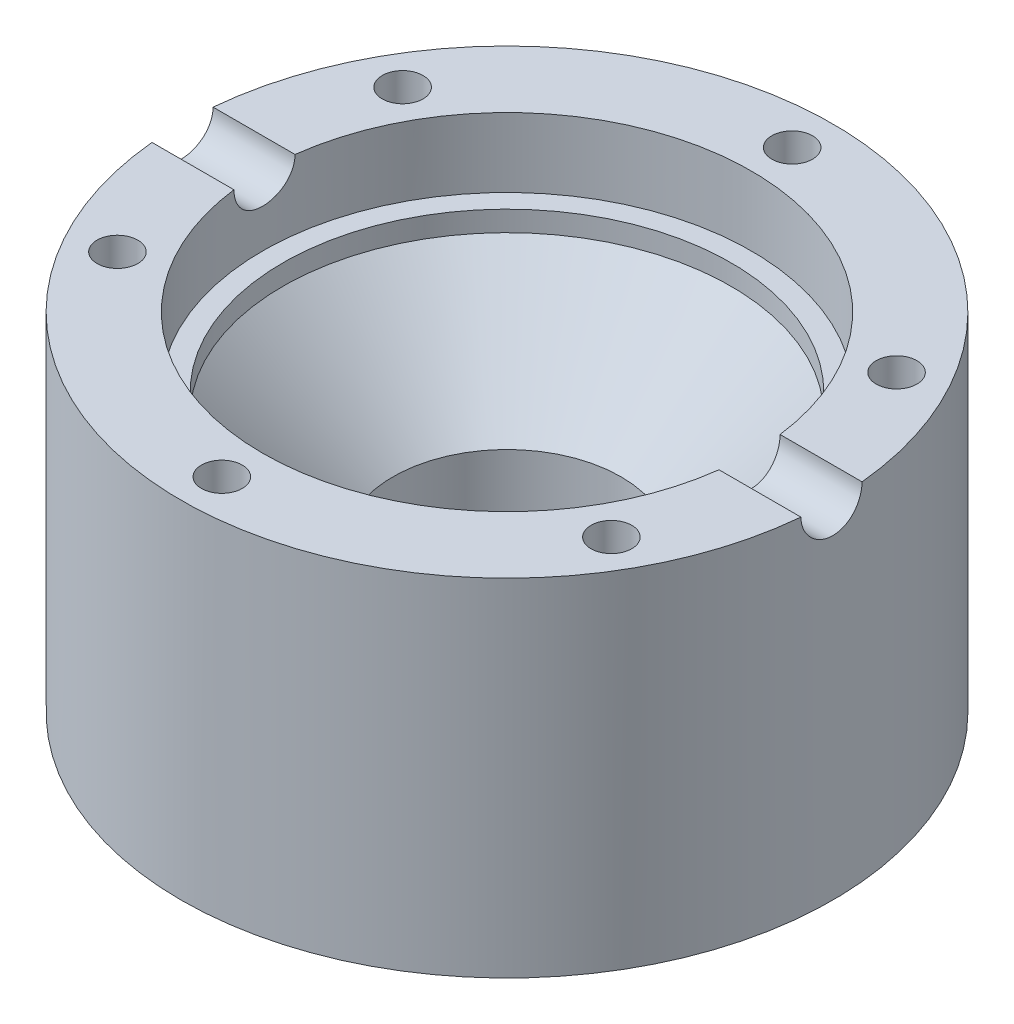
ISO-10303-21;
HEADER;
FILE_DESCRIPTION(('STEP AP214'),'2;1');
FILE_NAME('part.step','',(''),(''),'','','');
FILE_SCHEMA(('AUTOMOTIVE_DESIGN { 1 0 10303 214 1 1 1 1 }'));
ENDSEC;
DATA;
#1=APPLICATION_CONTEXT('core data for automotive mechanical design processes');
#2=APPLICATION_PROTOCOL_DEFINITION('international standard','automotive_design',2000,#1);
#3=PRODUCT_CONTEXT('',#1,'mechanical');
#4=PRODUCT('Part','Part','',(#3));
#5=PRODUCT_RELATED_PRODUCT_CATEGORY('part','',(#4));
#6=PRODUCT_DEFINITION_FORMATION('','',#4);
#7=PRODUCT_DEFINITION_CONTEXT('part definition',#1,'design');
#8=PRODUCT_DEFINITION('design','',#6,#7);
#9=PRODUCT_DEFINITION_SHAPE('','',#8);
#10=(LENGTH_UNIT() NAMED_UNIT(*) SI_UNIT(.MILLI.,.METRE.));
#11=(NAMED_UNIT(*) PLANE_ANGLE_UNIT() SI_UNIT($,.RADIAN.));
#12=(NAMED_UNIT(*) SI_UNIT($,.STERADIAN.) SOLID_ANGLE_UNIT());
#13=UNCERTAINTY_MEASURE_WITH_UNIT(LENGTH_MEASURE(1.E-05),#10,'distance_accuracy_value','');
#14=(GEOMETRIC_REPRESENTATION_CONTEXT(3) GLOBAL_UNCERTAINTY_ASSIGNED_CONTEXT((#13)) GLOBAL_UNIT_ASSIGNED_CONTEXT((#10,
#11,#12)) REPRESENTATION_CONTEXT('',''));
#15=CARTESIAN_POINT('',(0.,0.,0.));
#16=DIRECTION('',(0.,0.,1.));
#17=DIRECTION('',(1.,0.,0.));
#18=AXIS2_PLACEMENT_3D('',#15,#16,#17);
#19=CARTESIAN_POINT('',(0.,16.002,0.));
#20=DIRECTION('',(0.,1.,0.));
#21=DIRECTION('',(0.,0.,1.));
#22=AXIS2_PLACEMENT_3D('',#19,#20,#21);
#23=CONICAL_SURFACE('',#22,13.97,0.785398163397447);
#24=CARTESIAN_POINT('',(0.,16.002,0.));
#25=DIRECTION('',(0.,1.,0.));
#26=DIRECTION('',(0.,0.,1.));
#27=AXIS2_PLACEMENT_3D('',#24,#25,#26);
#28=CIRCLE('',#27,13.97);
#29=CARTESIAN_POINT('',(0.,16.002,13.97));
#30=VERTEX_POINT('',#29);
#31=EDGE_CURVE('E147',#30,#30,#28,.T.);
#32=ORIENTED_EDGE('',*,*,#31,.T.);
#33=EDGE_LOOP('',(#32));
#34=FACE_BOUND('',#33,.T.);
#35=CARTESIAN_POINT('',(0.,9.14399999999996,0.));
#36=DIRECTION('',(0.,1.,0.));
#37=DIRECTION('',(0.,0.,1.));
#38=AXIS2_PLACEMENT_3D('',#35,#36,#37);
#39=CIRCLE('',#38,7.112);
#40=CARTESIAN_POINT('',(0.,9.14399999999996,7.112));
#41=VERTEX_POINT('',#40);
#42=EDGE_CURVE('E216',#41,#41,#39,.F.);
#43=ORIENTED_EDGE('',*,*,#42,.T.);
#44=EDGE_LOOP('',(#43));
#45=FACE_BOUND('',#44,.T.);
#46=ADVANCED_FACE('F39',(#34,#45),#23,.F.);
#47=CARTESIAN_POINT('',(0.,21.59,0.));
#48=DIRECTION('',(0.,1.,0.));
#49=DIRECTION('',(0.,0.,1.));
#50=AXIS2_PLACEMENT_3D('',#47,#48,#49);
#51=PLANE('',#50);
#52=DIRECTION('',(1.,0.,0.));
#53=VECTOR('',#52,1.);
#54=CARTESIAN_POINT('',(-20.32,21.59,1.905));
#55=LINE('',#54,#53);
#56=CARTESIAN_POINT('',(-20.230506049034,21.59,1.905));
#57=VERTEX_POINT('',#56);
#58=CARTESIAN_POINT('',(-15.1204687427341,21.59,1.905));
#59=VERTEX_POINT('',#58);
#60=EDGE_CURVE('E61',#57,#59,#55,.T.);
#61=ORIENTED_EDGE('',*,*,#60,.F.);
#62=CARTESIAN_POINT('',(0.,21.59,0.));
#63=DIRECTION('',(0.,1.,0.));
#64=DIRECTION('',(0.,0.,1.));
#65=AXIS2_PLACEMENT_3D('',#62,#63,#64);
#66=CIRCLE('',#65,20.32);
#67=CARTESIAN_POINT('',(20.230506049034,21.59,1.905));
#68=VERTEX_POINT('',#67);
#69=EDGE_CURVE('E112',#57,#68,#66,.T.);
#70=ORIENTED_EDGE('',*,*,#69,.T.);
#71=CARTESIAN_POINT('',(15.1204687427341,21.59,1.905));
#72=VERTEX_POINT('',#71);
#73=EDGE_CURVE('E148',#72,#68,#55,.T.);
#74=ORIENTED_EDGE('',*,*,#73,.F.);
#75=CARTESIAN_POINT('',(0.,21.59,0.));
#76=DIRECTION('',(0.,1.,0.));
#77=DIRECTION('',(0.,0.,1.));
#78=AXIS2_PLACEMENT_3D('',#75,#76,#77);
#79=CIRCLE('',#78,15.24);
#80=EDGE_CURVE('E103',#59,#72,#79,.T.);
#81=ORIENTED_EDGE('',*,*,#80,.F.);
#82=EDGE_LOOP('',(#61,#70,#74,#81));
#83=FACE_BOUND('',#82,.T.);
#84=CARTESIAN_POINT('',(15.3979316792873,21.59,8.89000000000007));
#85=DIRECTION('',(0.,1.,0.));
#86=DIRECTION('',(-0.866025403784436,0.,-0.500000000000004));
#87=AXIS2_PLACEMENT_3D('',#84,#85,#86);
#88=CIRCLE('',#87,1.27);
#89=CARTESIAN_POINT('',(14.298079416481,21.59,8.25500000000007));
#90=VERTEX_POINT('',#89);
#91=EDGE_CURVE('E155',#90,#90,#88,.T.);
#92=ORIENTED_EDGE('',*,*,#91,.F.);
#93=EDGE_LOOP('',(#92));
#94=FACE_BOUND('',#93,.T.);
#95=CARTESIAN_POINT('',(0.,21.59,17.78));
#96=DIRECTION('',(0.,1.,0.));
#97=DIRECTION('',(0.,0.,-1.));
#98=AXIS2_PLACEMENT_3D('',#95,#96,#97);
#99=CIRCLE('',#98,1.27);
#100=CARTESIAN_POINT('',(0.,21.59,16.51));
#101=VERTEX_POINT('',#100);
#102=EDGE_CURVE('E163',#101,#101,#99,.T.);
#103=ORIENTED_EDGE('',*,*,#102,.F.);
#104=EDGE_LOOP('',(#103));
#105=FACE_BOUND('',#104,.T.);
#106=CARTESIAN_POINT('',(-15.3979316792874,21.59,8.88999999999985));
#107=DIRECTION('',(0.,1.,0.));
#108=DIRECTION('',(0.866025403784443,0.,-0.499999999999992));
#109=AXIS2_PLACEMENT_3D('',#106,#107,#108);
#110=CIRCLE('',#109,1.27);
#111=CARTESIAN_POINT('',(-14.2980794164812,21.59,8.25499999999986));
#112=VERTEX_POINT('',#111);
#113=EDGE_CURVE('E169',#112,#112,#110,.T.);
#114=ORIENTED_EDGE('',*,*,#113,.F.);
#115=EDGE_LOOP('',(#114));
#116=FACE_BOUND('',#115,.T.);
#117=ADVANCED_FACE('F200',(#83,#94,#105,#116),#51,.T.);
#118=CARTESIAN_POINT('',(0.,21.59,0.));
#119=DIRECTION('',(0.,-1.,0.));
#120=DIRECTION('',(0.,0.,-1.));
#121=AXIS2_PLACEMENT_3D('',#118,#119,#120);
#122=CYLINDRICAL_SURFACE('',#121,20.32);
#123=CARTESIAN_POINT('',(20.230506049034,21.59,-1.905));
#124=VERTEX_POINT('',#123);
#125=CARTESIAN_POINT('',(-20.230506049034,21.59,-1.905));
#126=VERTEX_POINT('',#125);
#127=EDGE_CURVE('E92',#124,#126,#66,.T.);
#128=ORIENTED_EDGE('',*,*,#127,.F.);
#129=CARTESIAN_POINT('',(20.230506049034,21.59,-1.905));
#130=CARTESIAN_POINT('',(20.2305048419639,21.536529886188,-1.9049997844618));
#131=CARTESIAN_POINT('',(20.2307183050446,21.4830855041032,-1.9027473617315));
#132=CARTESIAN_POINT('',(20.231561824142,21.3765814709534,-1.89376245028911));
#133=CARTESIAN_POINT('',(20.232191853417,21.3235217954131,-1.88703024915808));
#134=CARTESIAN_POINT('',(20.2346847598082,21.165596507574,-1.86018187930186));
#135=CARTESIAN_POINT('',(20.2371505441765,21.0617924238009,-1.83341374337296));
#136=CARTESIAN_POINT('',(20.2434143344982,20.8601801826428,-1.76289924237057));
#137=CARTESIAN_POINT('',(20.2472128561946,20.7623743637062,-1.71914630381519));
#138=CARTESIAN_POINT('',(20.2557124201876,20.5754921060027,-1.61591652294307));
#139=CARTESIAN_POINT('',(20.2604133454438,20.4864145374543,-1.55644171935339));
#140=CARTESIAN_POINT('',(20.2702044665111,20.3192475841751,-1.42325956423772));
#141=CARTESIAN_POINT('',(20.275295701896,20.2411892368867,-1.34951334578633));
#142=CARTESIAN_POINT('',(20.2852849434553,20.0985286835315,-1.18995465134418));
#143=CARTESIAN_POINT('',(20.2901829201158,20.0339285263536,-1.10414034142077));
#144=CARTESIAN_POINT('',(20.2992435007207,19.9199224956263,-0.922695322511813));
#145=CARTESIAN_POINT('',(20.3034047538332,19.8705444124154,-0.82704707951139));
#146=CARTESIAN_POINT('',(20.3105112772975,19.7885643113934,-0.628777299116423));
#147=CARTESIAN_POINT('',(20.3134566474185,19.7559609170826,-0.526156334673046));
#148=CARTESIAN_POINT('',(20.3177924388191,19.708544192658,-0.317169118568316));
#149=CARTESIAN_POINT('',(20.3191874090494,19.6936788088358,-0.21081477315429));
#150=CARTESIAN_POINT('',(20.320280691444,19.6819989793944,0.00289048637267596));
#151=CARTESIAN_POINT('',(20.3199790011529,19.6851845598983,0.110241401927612));
#152=CARTESIAN_POINT('',(20.3177166277443,19.7094744976171,0.322533435230876));
#153=CARTESIAN_POINT('',(20.3157611751202,19.7305223610124,0.427481080398319));
#154=CARTESIAN_POINT('',(20.310417139208,19.7898513703165,0.632347006443153));
#155=CARTESIAN_POINT('',(20.3070285462902,19.8281326320223,0.73226525352129));
#156=CARTESIAN_POINT('',(20.2991902282816,19.9209049459651,0.924417241106757));
#157=CARTESIAN_POINT('',(20.2947388396777,19.9754214434005,1.01663862581396));
#158=CARTESIAN_POINT('',(20.2852749987263,20.0990958055314,1.19063953581827));
#159=CARTESIAN_POINT('',(20.2802625572437,20.1682533867244,1.2724192632531));
#160=CARTESIAN_POINT('',(20.2702171335259,20.3195536154736,1.42354012541889));
#161=CARTESIAN_POINT('',(20.2651841441853,20.4017435671613,1.49283390216885));
#162=CARTESIAN_POINT('',(20.2556819366046,20.5766461295877,1.61666960669434));
#163=CARTESIAN_POINT('',(20.2512128909555,20.6693619452808,1.67120702420478));
#164=CARTESIAN_POINT('',(20.2433434763916,20.8627316881732,1.76397923375594));
#165=CARTESIAN_POINT('',(20.2399439313991,20.9633916610879,1.80220146494809));
#166=CARTESIAN_POINT('',(20.2346109412246,21.1696641572812,1.86113143952841));
#167=CARTESIAN_POINT('',(20.2326752763653,21.2752689235142,1.88186570539399));
#168=CARTESIAN_POINT('',(20.2312213758828,21.416340356759,1.89738948822792));
#169=CARTESIAN_POINT('',(20.230953293904,21.4510410774768,1.90024485867607));
#170=CARTESIAN_POINT('',(20.2305958533842,21.520489726054,1.90404753411258));
#171=CARTESIAN_POINT('',(20.2305061969765,21.5552374781665,1.90499801916789));
#172=CARTESIAN_POINT('',(20.230506049034,21.59,1.905));
#173=B_SPLINE_CURVE_WITH_KNOTS('',3,(#129,#130,#131,#132,#133,#134,#135,#136,#137,#138,#139,
#140,#141,#142,#143,#144,#145,#146,#147,#148,#149,#150,#151,#152,#153,#154,#155,#156,#157,#158,
#159,#160,#161,#162,#163,#164,#165,#166,#167,#168,#169,#170,#171,#172),.UNSPECIFIED.,.F.,.F.,(4,
2,2,2,2,2,2,2,2,2,2,2,2,2,2,2,2,2,2,2,2,4),(0.,0.16031144516378,0.320612600067446,
0.640645643669809,0.960802670588063,1.28091820160995,1.60191812979215,1.92296689168407,
2.24459835512714,2.56620342187747,2.88686237159023,3.20752178535595,3.52717079906967,
3.846821960646,4.16697676631038,4.48712537322918,4.80846382175077,5.1299003763531,
5.45158395635061,5.77277878504201,5.8771981883666,5.98144312543351),.UNSPECIFIED.);
#174=EDGE_CURVE('E141',#124,#68,#173,.T.);
#175=ORIENTED_EDGE('',*,*,#174,.T.);
#176=ORIENTED_EDGE('',*,*,#69,.F.);
#177=CARTESIAN_POINT('',(-20.230506049034,21.59,1.905));
#178=CARTESIAN_POINT('',(-20.2305048419639,21.536529886188,1.9049997844618));
#179=CARTESIAN_POINT('',(-20.2307183050446,21.4830855041032,1.9027473617315));
#180=CARTESIAN_POINT('',(-20.231561824142,21.3765814709534,1.89376245028911));
#181=CARTESIAN_POINT('',(-20.232191853417,21.3235217954131,1.88703024915808));
#182=CARTESIAN_POINT('',(-20.2346847598082,21.165596507574,1.86018187930186));
#183=CARTESIAN_POINT('',(-20.2371505441765,21.0617924238009,1.83341374337296));
#184=CARTESIAN_POINT('',(-20.2434143344982,20.8601801826428,1.76289924237057));
#185=CARTESIAN_POINT('',(-20.2472128561946,20.7623743637062,1.71914630381519));
#186=CARTESIAN_POINT('',(-20.2557124201876,20.5754921060027,1.61591652294307));
#187=CARTESIAN_POINT('',(-20.2604133454438,20.4864145374543,1.55644171935339));
#188=CARTESIAN_POINT('',(-20.2702044665111,20.3192475841751,1.42325956423772));
#189=CARTESIAN_POINT('',(-20.275295701896,20.2411892368867,1.34951334578633));
#190=CARTESIAN_POINT('',(-20.2852849434553,20.0985286835315,1.18995465134418));
#191=CARTESIAN_POINT('',(-20.2901829201158,20.0339285263536,1.10414034142077));
#192=CARTESIAN_POINT('',(-20.2992435007207,19.9199224956263,0.922695322511813));
#193=CARTESIAN_POINT('',(-20.3034047538332,19.8705444124154,0.82704707951139));
#194=CARTESIAN_POINT('',(-20.3105112772975,19.7885643113934,0.628777299116423));
#195=CARTESIAN_POINT('',(-20.3134566474185,19.7559609170826,0.526156334673046));
#196=CARTESIAN_POINT('',(-20.3177924388191,19.708544192658,0.317169118568316));
#197=CARTESIAN_POINT('',(-20.3191874090494,19.6936788088358,0.21081477315429));
#198=CARTESIAN_POINT('',(-20.320280691444,19.6819989793944,-0.00289048637267596));
#199=CARTESIAN_POINT('',(-20.3199790011529,19.6851845598983,-0.110241401927612));
#200=CARTESIAN_POINT('',(-20.3177166277443,19.7094744976171,-0.322533435230876));
#201=CARTESIAN_POINT('',(-20.3157611751202,19.7305223610124,-0.427481080398319));
#202=CARTESIAN_POINT('',(-20.310417139208,19.7898513703165,-0.632347006443153));
#203=CARTESIAN_POINT('',(-20.3070285462902,19.8281326320223,-0.73226525352129));
#204=CARTESIAN_POINT('',(-20.2991902282816,19.9209049459651,-0.924417241106757));
#205=CARTESIAN_POINT('',(-20.2947388396777,19.9754214434005,-1.01663862581396));
#206=CARTESIAN_POINT('',(-20.2852749987263,20.0990958055314,-1.19063953581827));
#207=CARTESIAN_POINT('',(-20.2802625572437,20.1682533867244,-1.2724192632531));
#208=CARTESIAN_POINT('',(-20.2702171335259,20.3195536154736,-1.42354012541889));
#209=CARTESIAN_POINT('',(-20.2651841441853,20.4017435671613,-1.49283390216885));
#210=CARTESIAN_POINT('',(-20.2556819366046,20.5766461295877,-1.61666960669434));
#211=CARTESIAN_POINT('',(-20.2512128909555,20.6693619452808,-1.67120702420478));
#212=CARTESIAN_POINT('',(-20.2433434763916,20.8627316881732,-1.76397923375594));
#213=CARTESIAN_POINT('',(-20.2399439313991,20.9633916610879,-1.80220146494809));
#214=CARTESIAN_POINT('',(-20.2346109412246,21.1696641572812,-1.86113143952841));
#215=CARTESIAN_POINT('',(-20.2326752763653,21.2752689235142,-1.88186570539399));
#216=CARTESIAN_POINT('',(-20.2312213758828,21.416340356759,-1.89738948822792));
#217=CARTESIAN_POINT('',(-20.230953293904,21.4510410774768,-1.90024485867607));
#218=CARTESIAN_POINT('',(-20.2305958533842,21.520489726054,-1.90404753411258));
#219=CARTESIAN_POINT('',(-20.2305061969765,21.5552374781665,-1.90499801916789));
#220=CARTESIAN_POINT('',(-20.230506049034,21.59,-1.905));
#221=B_SPLINE_CURVE_WITH_KNOTS('',3,(#177,#178,#179,#180,#181,#182,#183,#184,#185,#186,#187,
#188,#189,#190,#191,#192,#193,#194,#195,#196,#197,#198,#199,#200,#201,#202,#203,#204,#205,#206,
#207,#208,#209,#210,#211,#212,#213,#214,#215,#216,#217,#218,#219,#220),.UNSPECIFIED.,.F.,.F.,(4,
2,2,2,2,2,2,2,2,2,2,2,2,2,2,2,2,2,2,2,2,4),(0.,0.16031144516378,0.320612600067446,
0.640645643669809,0.960802670588063,1.28091820160995,1.60191812979215,1.92296689168407,
2.24459835512714,2.56620342187747,2.88686237159023,3.20752178535595,3.52717079906967,
3.846821960646,4.16697676631038,4.48712537322918,4.80846382175077,5.1299003763531,
5.45158395635061,5.77277878504201,5.8771981883666,5.98144312543351),.UNSPECIFIED.);
#222=EDGE_CURVE('E135',#57,#126,#221,.T.);
#223=ORIENTED_EDGE('',*,*,#222,.T.);
#224=EDGE_LOOP('',(#128,#175,#176,#223));
#225=FACE_BOUND('',#224,.T.);
#226=CARTESIAN_POINT('',(0.,0.,0.));
#227=DIRECTION('',(0.,1.,0.));
#228=DIRECTION('',(0.,0.,1.));
#229=AXIS2_PLACEMENT_3D('',#226,#227,#228);
#230=CIRCLE('',#229,20.32);
#231=CARTESIAN_POINT('',(0.,0.,20.32));
#232=VERTEX_POINT('',#231);
#233=EDGE_CURVE('E106',#232,#232,#230,.T.);
#234=ORIENTED_EDGE('',*,*,#233,.T.);
#235=EDGE_LOOP('',(#234));
#236=FACE_BOUND('',#235,.T.);
#237=ADVANCED_FACE('F41',(#225,#236),#122,.T.);
#238=DIRECTION('',(1.,0.,0.));
#239=VECTOR('',#238,1.);
#240=CARTESIAN_POINT('',(-20.32,21.59,-1.905));
#241=LINE('',#240,#239);
#242=CARTESIAN_POINT('',(15.1204687427341,21.59,-1.905));
#243=VERTEX_POINT('',#242);
#244=EDGE_CURVE('E69',#124,#243,#241,.F.);
#245=ORIENTED_EDGE('',*,*,#244,.F.);
#246=ORIENTED_EDGE('',*,*,#127,.T.);
#247=CARTESIAN_POINT('',(-15.1204687427341,21.59,-1.905));
#248=VERTEX_POINT('',#247);
#249=EDGE_CURVE('E86',#248,#126,#241,.F.);
#250=ORIENTED_EDGE('',*,*,#249,.F.);
#251=EDGE_CURVE('E97',#243,#248,#79,.T.);
#252=ORIENTED_EDGE('',*,*,#251,.F.);
#253=EDGE_LOOP('',(#245,#246,#250,#252));
#254=FACE_BOUND('',#253,.T.);
#255=CARTESIAN_POINT('',(-15.3979316792872,21.59,-8.89000000000018));
#256=DIRECTION('',(0.,1.,0.));
#257=DIRECTION('',(0.866025403784433,0.,0.50000000000001));
#258=AXIS2_PLACEMENT_3D('',#255,#256,#257);
#259=CIRCLE('',#258,1.27);
#260=CARTESIAN_POINT('',(-14.298079416481,21.59,-8.25500000000017));
#261=VERTEX_POINT('',#260);
#262=EDGE_CURVE('E154',#261,#261,#259,.T.);
#263=ORIENTED_EDGE('',*,*,#262,.F.);
#264=EDGE_LOOP('',(#263));
#265=FACE_BOUND('',#264,.T.);
#266=CARTESIAN_POINT('',(15.3979316792873,21.59,-8.88999999999996));
#267=DIRECTION('',(0.,1.,0.));
#268=DIRECTION('',(-0.86602540378444,0.,0.499999999999998));
#269=AXIS2_PLACEMENT_3D('',#266,#267,#268);
#270=CIRCLE('',#269,1.27);
#271=CARTESIAN_POINT('',(14.2980794164811,21.59,-8.25499999999996));
#272=VERTEX_POINT('',#271);
#273=EDGE_CURVE('E162',#272,#272,#270,.T.);
#274=ORIENTED_EDGE('',*,*,#273,.F.);
#275=EDGE_LOOP('',(#274));
#276=FACE_BOUND('',#275,.T.);
#277=CARTESIAN_POINT('',(0.,21.59,-17.78));
#278=DIRECTION('',(0.,1.,0.));
#279=DIRECTION('',(0.,0.,1.));
#280=AXIS2_PLACEMENT_3D('',#277,#278,#279);
#281=CIRCLE('',#280,1.27);
#282=CARTESIAN_POINT('',(0.,21.59,-16.51));
#283=VERTEX_POINT('',#282);
#284=EDGE_CURVE('E183',#283,#283,#281,.T.);
#285=ORIENTED_EDGE('',*,*,#284,.F.);
#286=EDGE_LOOP('',(#285));
#287=FACE_BOUND('',#286,.T.);
#288=ADVANCED_FACE('F95',(#254,#265,#276,#287),#51,.T.);
#289=CARTESIAN_POINT('',(0.,0.,0.));
#290=DIRECTION('',(0.,1.,0.));
#291=DIRECTION('',(0.,0.,1.));
#292=AXIS2_PLACEMENT_3D('',#289,#290,#291);
#293=PLANE('',#292);
#294=CARTESIAN_POINT('',(0.,0.,0.));
#295=DIRECTION('',(0.,1.,0.));
#296=DIRECTION('',(0.,0.,1.));
#297=AXIS2_PLACEMENT_3D('',#294,#295,#296);
#298=CIRCLE('',#297,7.112);
#299=CARTESIAN_POINT('',(0.,0.,7.112));
#300=VERTEX_POINT('',#299);
#301=EDGE_CURVE('E99',#300,#300,#298,.T.);
#302=ORIENTED_EDGE('',*,*,#301,.T.);
#303=EDGE_LOOP('',(#302));
#304=FACE_BOUND('',#303,.T.);
#305=CARTESIAN_POINT('',(-15.3979316792872,0.,-8.89000000000018));
#306=DIRECTION('',(0.,1.,0.));
#307=DIRECTION('',(0.,0.,1.));
#308=AXIS2_PLACEMENT_3D('',#305,#306,#307);
#309=CIRCLE('',#308,1.27);
#310=CARTESIAN_POINT('',(-15.3979316792872,0.,-7.62000000000018));
#311=VERTEX_POINT('',#310);
#312=EDGE_CURVE('E172',#311,#311,#309,.F.);
#313=ORIENTED_EDGE('',*,*,#312,.F.);
#314=EDGE_LOOP('',(#313));
#315=FACE_BOUND('',#314,.T.);
#316=CARTESIAN_POINT('',(-15.3979316792874,0.,8.88999999999985));
#317=DIRECTION('',(0.,1.,0.));
#318=DIRECTION('',(0.,0.,1.));
#319=AXIS2_PLACEMENT_3D('',#316,#317,#318);
#320=CIRCLE('',#319,1.27);
#321=CARTESIAN_POINT('',(-15.3979316792874,0.,10.1599999999999));
#322=VERTEX_POINT('',#321);
#323=EDGE_CURVE('E166',#322,#322,#320,.F.);
#324=ORIENTED_EDGE('',*,*,#323,.F.);
#325=EDGE_LOOP('',(#324));
#326=FACE_BOUND('',#325,.T.);
#327=CARTESIAN_POINT('',(0.,0.,17.78));
#328=DIRECTION('',(0.,1.,0.));
#329=DIRECTION('',(0.,0.,1.));
#330=AXIS2_PLACEMENT_3D('',#327,#328,#329);
#331=CIRCLE('',#330,1.27);
#332=CARTESIAN_POINT('',(0.,0.,19.05));
#333=VERTEX_POINT('',#332);
#334=EDGE_CURVE('E159',#333,#333,#331,.F.);
#335=ORIENTED_EDGE('',*,*,#334,.F.);
#336=EDGE_LOOP('',(#335));
#337=FACE_BOUND('',#336,.T.);
#338=CARTESIAN_POINT('',(15.3979316792873,0.,8.89000000000007));
#339=DIRECTION('',(0.,1.,0.));
#340=DIRECTION('',(0.,0.,1.));
#341=AXIS2_PLACEMENT_3D('',#338,#339,#340);
#342=CIRCLE('',#341,1.27);
#343=CARTESIAN_POINT('',(15.3979316792873,0.,10.1600000000001));
#344=VERTEX_POINT('',#343);
#345=EDGE_CURVE('E158',#344,#344,#342,.F.);
#346=ORIENTED_EDGE('',*,*,#345,.F.);
#347=EDGE_LOOP('',(#346));
#348=FACE_BOUND('',#347,.T.);
#349=CARTESIAN_POINT('',(15.3979316792873,0.,-8.88999999999996));
#350=DIRECTION('',(0.,1.,0.));
#351=DIRECTION('',(0.,0.,1.));
#352=AXIS2_PLACEMENT_3D('',#349,#350,#351);
#353=CIRCLE('',#352,1.27);
#354=CARTESIAN_POINT('',(15.3979316792873,0.,-7.61999999999996));
#355=VERTEX_POINT('',#354);
#356=EDGE_CURVE('E181',#355,#355,#353,.F.);
#357=ORIENTED_EDGE('',*,*,#356,.F.);
#358=EDGE_LOOP('',(#357));
#359=FACE_BOUND('',#358,.T.);
#360=CARTESIAN_POINT('',(0.,0.,-17.78));
#361=DIRECTION('',(0.,1.,0.));
#362=DIRECTION('',(0.,0.,1.));
#363=AXIS2_PLACEMENT_3D('',#360,#361,#362);
#364=CIRCLE('',#363,1.27);
#365=CARTESIAN_POINT('',(0.,0.,-16.51));
#366=VERTEX_POINT('',#365);
#367=EDGE_CURVE('E108',#366,#366,#364,.F.);
#368=ORIENTED_EDGE('',*,*,#367,.F.);
#369=EDGE_LOOP('',(#368));
#370=FACE_BOUND('',#369,.T.);
#371=ORIENTED_EDGE('',*,*,#233,.F.);
#372=EDGE_LOOP('',(#371));
#373=FACE_BOUND('',#372,.T.);
#374=ADVANCED_FACE('F192',(#304,#315,#326,#337,#348,#359,#370,#373),#293,.F.);
#375=CARTESIAN_POINT('',(0.,17.272,0.));
#376=DIRECTION('',(0.,-1.,0.));
#377=DIRECTION('',(0.,0.,-1.));
#378=AXIS2_PLACEMENT_3D('',#375,#376,#377);
#379=PLANE('',#378);
#380=CARTESIAN_POINT('',(0.,17.272,0.));
#381=DIRECTION('',(0.,1.,0.));
#382=DIRECTION('',(0.,0.,1.));
#383=AXIS2_PLACEMENT_3D('',#380,#381,#382);
#384=CIRCLE('',#383,13.97);
#385=CARTESIAN_POINT('',(0.,17.272,13.97));
#386=VERTEX_POINT('',#385);
#387=EDGE_CURVE('E151',#386,#386,#384,.T.);
#388=ORIENTED_EDGE('',*,*,#387,.F.);
#389=EDGE_LOOP('',(#388));
#390=FACE_BOUND('',#389,.T.);
#391=CARTESIAN_POINT('',(0.,17.272,0.));
#392=DIRECTION('',(0.,1.,0.));
#393=DIRECTION('',(0.,0.,1.));
#394=AXIS2_PLACEMENT_3D('',#391,#392,#393);
#395=CIRCLE('',#394,15.24);
#396=CARTESIAN_POINT('',(0.,17.272,15.24));
#397=VERTEX_POINT('',#396);
#398=EDGE_CURVE('E102',#397,#397,#395,.T.);
#399=ORIENTED_EDGE('',*,*,#398,.T.);
#400=EDGE_LOOP('',(#399));
#401=FACE_BOUND('',#400,.T.);
#402=ADVANCED_FACE('F195',(#390,#401),#379,.F.);
#403=CARTESIAN_POINT('',(0.,22.7834708396849,0.));
#404=DIRECTION('',(0.,1.,0.));
#405=DIRECTION('',(0.,0.,1.));
#406=AXIS2_PLACEMENT_3D('',#403,#404,#405);
#407=CYLINDRICAL_SURFACE('',#406,15.24);
#408=ORIENTED_EDGE('',*,*,#398,.F.);
#409=EDGE_LOOP('',(#408));
#410=FACE_BOUND('',#409,.T.);
#411=ORIENTED_EDGE('',*,*,#80,.T.);
#412=CARTESIAN_POINT('',(15.1204687427341,21.59,1.905));
#413=CARTESIAN_POINT('',(15.1204671133158,21.5366274694487,1.90499989360323));
#414=CARTESIAN_POINT('',(15.1207516960141,21.4832807142874,1.90275557371027));
#415=CARTESIAN_POINT('',(15.1218761272803,21.3769730548197,1.89380370376915));
#416=CARTESIAN_POINT('',(15.1227159330873,21.3240121211164,1.88709649743353));
#417=CARTESIAN_POINT('',(15.1260382733685,21.1663984931321,1.86035199624362));
#418=CARTESIAN_POINT('',(15.1293238596181,21.0628080964398,1.83369159466202));
#419=CARTESIAN_POINT('',(15.1376673852147,20.861620704,1.7634796516013));
#420=CARTESIAN_POINT('',(15.1427259043614,20.7640256811972,1.7199225839306));
#421=CARTESIAN_POINT('',(15.1540430006239,20.5775222303475,1.61717104967699));
#422=CARTESIAN_POINT('',(15.1603014840875,20.4886131252186,1.55797780329504));
#423=CARTESIAN_POINT('',(15.1733517718042,20.3215303034019,1.42528888368464));
#424=CARTESIAN_POINT('',(15.1801460390645,20.2434113248636,1.35172454974884));
#425=CARTESIAN_POINT('',(15.1934810047301,20.1005844792215,1.19251997482523));
#426=CARTESIAN_POINT('',(15.2000216643625,20.0358786562646,1.10687789654226));
#427=CARTESIAN_POINT('',(15.2121372273219,19.9215278900306,0.925606187493565));
#428=CARTESIAN_POINT('',(15.2177088874507,19.8719331216397,0.82994467080198));
#429=CARTESIAN_POINT('',(15.227230921244,19.7895359420639,0.631575103477016));
#430=CARTESIAN_POINT('',(15.2311814509705,19.7567319144036,0.528867732240988));
#431=CARTESIAN_POINT('',(15.2369989700154,19.7090093270864,0.319885582650471));
#432=CARTESIAN_POINT('',(15.238876727411,19.6939983022197,0.213632223959192));
#433=CARTESIAN_POINT('',(15.2403739201908,19.6820011668644,9.64844855354512E-05));
#434=CARTESIAN_POINT('',(15.2399933897453,19.6850147836439,-0.10718588070235));
#435=CARTESIAN_POINT('',(15.2370255120095,19.7089079343474,-0.319099425091587));
#436=CARTESIAN_POINT('',(15.2344505108576,19.7296875186708,-0.423742070832131));
#437=CARTESIAN_POINT('',(15.2273969220193,19.7883664109259,-0.628042592241167));
#438=CARTESIAN_POINT('',(15.2229183084999,19.8262659511842,-0.727700400242478));
#439=CARTESIAN_POINT('',(15.2125393743087,19.9182159912449,-0.91951414621205));
#440=CARTESIAN_POINT('',(15.2066352272363,19.9723100555869,-1.01164898500401));
#441=CARTESIAN_POINT('',(15.1940661225624,20.0950796970392,-1.18556685508717));
#442=CARTESIAN_POINT('',(15.1874011621984,20.1637553270964,-1.26734984878812));
#443=CARTESIAN_POINT('',(15.1740031558885,20.3142875574399,-1.41882368657018));
#444=CARTESIAN_POINT('',(15.1672699531323,20.3962294871063,-1.48842973472849));
#445=CARTESIAN_POINT('',(15.1545364101041,20.5707090315983,-1.61293430049883));
#446=CARTESIAN_POINT('',(15.1485362879528,20.6632497842066,-1.66782844650226));
#447=CARTESIAN_POINT('',(15.1379475348401,20.8563881000082,-1.76135479044095));
#448=CARTESIAN_POINT('',(15.1333603353297,20.9569937046552,-1.79997051098206));
#449=CARTESIAN_POINT('',(15.1261400717429,21.1632586727981,-1.85967907137902));
#450=CARTESIAN_POINT('',(15.1235040655381,21.2689101706377,-1.88079829927213));
#451=CARTESIAN_POINT('',(15.1214844556447,21.4111015845191,-1.89692242472637));
#452=CARTESIAN_POINT('',(15.1211038339826,21.4468447887333,-1.8999529522091));
#453=CARTESIAN_POINT('',(15.1205962736803,21.5183869490137,-1.90398903079193));
#454=CARTESIAN_POINT('',(15.120468909919,21.5541857105297,-1.90499797536143));
#455=CARTESIAN_POINT('',(15.1204687427341,21.59,-1.905));
#456=B_SPLINE_CURVE_WITH_KNOTS('',3,(#412,#413,#414,#415,#416,#417,#418,#419,#420,#421,#422,
#423,#424,#425,#426,#427,#428,#429,#430,#431,#432,#433,#434,#435,#436,#437,#438,#439,#440,#441,
#442,#443,#444,#445,#446,#447,#448,#449,#450,#451,#452,#453,#454,#455),.UNSPECIFIED.,.F.,.F.,(4,
2,2,2,2,2,2,2,2,2,2,2,2,2,2,2,2,2,2,2,2,4),(0.,0.160018584498594,0.320024846472049,
0.639424691784234,0.958929087597173,1.27840855759819,1.59945347806483,1.92054728943376,
2.24269592800397,2.56481354689786,2.88524976829882,3.20568114116946,3.52432157201225,
3.84296632709827,4.16247608380281,4.48198700069737,4.80364123975377,5.12539095193678,
5.44746556901604,5.76905354746729,5.87663169144012,5.98402910079674),.UNSPECIFIED.);
#457=EDGE_CURVE('E11',#72,#243,#456,.T.);
#458=ORIENTED_EDGE('',*,*,#457,.T.);
#459=ORIENTED_EDGE('',*,*,#251,.T.);
#460=CARTESIAN_POINT('',(-15.1204687427341,21.59,-1.905));
#461=CARTESIAN_POINT('',(-15.1204671133158,21.5366274694487,-1.90499989360323));
#462=CARTESIAN_POINT('',(-15.1207516960141,21.4832807142874,-1.90275557371027));
#463=CARTESIAN_POINT('',(-15.1218761272803,21.3769730548197,-1.89380370376915));
#464=CARTESIAN_POINT('',(-15.1227159330873,21.3240121211164,-1.88709649743353));
#465=CARTESIAN_POINT('',(-15.1260382733685,21.1663984931321,-1.86035199624362));
#466=CARTESIAN_POINT('',(-15.1293238596181,21.0628080964398,-1.83369159466202));
#467=CARTESIAN_POINT('',(-15.1376673852147,20.861620704,-1.7634796516013));
#468=CARTESIAN_POINT('',(-15.1427259043614,20.7640256811972,-1.7199225839306));
#469=CARTESIAN_POINT('',(-15.1540430006239,20.5775222303475,-1.61717104967699));
#470=CARTESIAN_POINT('',(-15.1603014840875,20.4886131252186,-1.55797780329504));
#471=CARTESIAN_POINT('',(-15.1733517718042,20.3215303034019,-1.42528888368464));
#472=CARTESIAN_POINT('',(-15.1801460390645,20.2434113248636,-1.35172454974884));
#473=CARTESIAN_POINT('',(-15.1934810047301,20.1005844792215,-1.19251997482523));
#474=CARTESIAN_POINT('',(-15.2000216643625,20.0358786562646,-1.10687789654226));
#475=CARTESIAN_POINT('',(-15.2121372273219,19.9215278900306,-0.925606187493565));
#476=CARTESIAN_POINT('',(-15.2177088874507,19.8719331216397,-0.82994467080198));
#477=CARTESIAN_POINT('',(-15.227230921244,19.7895359420639,-0.631575103477016));
#478=CARTESIAN_POINT('',(-15.2311814509705,19.7567319144036,-0.528867732240988));
#479=CARTESIAN_POINT('',(-15.2369989700154,19.7090093270864,-0.319885582650471));
#480=CARTESIAN_POINT('',(-15.238876727411,19.6939983022197,-0.213632223959192));
#481=CARTESIAN_POINT('',(-15.2403739201908,19.6820011668644,-9.64844855354512E-05));
#482=CARTESIAN_POINT('',(-15.2399933897453,19.6850147836439,0.10718588070235));
#483=CARTESIAN_POINT('',(-15.2370255120095,19.7089079343474,0.319099425091587));
#484=CARTESIAN_POINT('',(-15.2344505108576,19.7296875186708,0.423742070832131));
#485=CARTESIAN_POINT('',(-15.2273969220193,19.7883664109259,0.628042592241167));
#486=CARTESIAN_POINT('',(-15.2229183084999,19.8262659511842,0.727700400242478));
#487=CARTESIAN_POINT('',(-15.2125393743087,19.9182159912449,0.91951414621205));
#488=CARTESIAN_POINT('',(-15.2066352272363,19.9723100555869,1.01164898500401));
#489=CARTESIAN_POINT('',(-15.1940661225624,20.0950796970392,1.18556685508717));
#490=CARTESIAN_POINT('',(-15.1874011621984,20.1637553270964,1.26734984878812));
#491=CARTESIAN_POINT('',(-15.1740031558885,20.3142875574399,1.41882368657018));
#492=CARTESIAN_POINT('',(-15.1672699531323,20.3962294871063,1.48842973472849));
#493=CARTESIAN_POINT('',(-15.1545364101041,20.5707090315983,1.61293430049883));
#494=CARTESIAN_POINT('',(-15.1485362879528,20.6632497842066,1.66782844650226));
#495=CARTESIAN_POINT('',(-15.1379475348401,20.8563881000082,1.76135479044095));
#496=CARTESIAN_POINT('',(-15.1333603353297,20.9569937046552,1.79997051098206));
#497=CARTESIAN_POINT('',(-15.1261400717429,21.1632586727981,1.85967907137902));
#498=CARTESIAN_POINT('',(-15.1235040655381,21.2689101706377,1.88079829927213));
#499=CARTESIAN_POINT('',(-15.1214844556447,21.4111015845191,1.89692242472637));
#500=CARTESIAN_POINT('',(-15.1211038339826,21.4468447887333,1.8999529522091));
#501=CARTESIAN_POINT('',(-15.1205962736803,21.5183869490137,1.90398903079193));
#502=CARTESIAN_POINT('',(-15.120468909919,21.5541857105297,1.90499797536143));
#503=CARTESIAN_POINT('',(-15.1204687427341,21.59,1.905));
#504=B_SPLINE_CURVE_WITH_KNOTS('',3,(#460,#461,#462,#463,#464,#465,#466,#467,#468,#469,#470,
#471,#472,#473,#474,#475,#476,#477,#478,#479,#480,#481,#482,#483,#484,#485,#486,#487,#488,#489,
#490,#491,#492,#493,#494,#495,#496,#497,#498,#499,#500,#501,#502,#503),.UNSPECIFIED.,.F.,.F.,(4,
2,2,2,2,2,2,2,2,2,2,2,2,2,2,2,2,2,2,2,2,4),(0.,0.160018584498594,0.320024846472049,
0.639424691784234,0.958929087597173,1.27840855759819,1.59945347806483,1.92054728943376,
2.24269592800397,2.56481354689786,2.88524976829882,3.20568114116946,3.52432157201225,
3.84296632709827,4.16247608380281,4.48198700069737,4.80364123975377,5.12539095193678,
5.44746556901604,5.76905354746729,5.87663169144012,5.98402910079674),.UNSPECIFIED.);
#505=EDGE_CURVE('E54',#248,#59,#504,.T.);
#506=ORIENTED_EDGE('',*,*,#505,.T.);
#507=EDGE_LOOP('',(#411,#458,#459,#506));
#508=FACE_BOUND('',#507,.T.);
#509=ADVANCED_FACE('F101',(#410,#508),#407,.F.);
#510=CARTESIAN_POINT('',(0.,-0.001000000000001,-17.78));
#511=DIRECTION('',(0.,1.,0.));
#512=DIRECTION('',(0.,0.,1.));
#513=AXIS2_PLACEMENT_3D('',#510,#511,#512);
#514=CYLINDRICAL_SURFACE('',#513,1.27);
#515=ORIENTED_EDGE('',*,*,#284,.T.);
#516=EDGE_LOOP('',(#515));
#517=FACE_BOUND('',#516,.T.);
#518=ORIENTED_EDGE('',*,*,#367,.T.);
#519=EDGE_LOOP('',(#518));
#520=FACE_BOUND('',#519,.T.);
#521=ADVANCED_FACE('F190',(#517,#520),#514,.F.);
#522=CARTESIAN_POINT('',(15.3979316792873,-0.001000000000001,-8.88999999999996));
#523=DIRECTION('',(0.,1.,0.));
#524=DIRECTION('',(0.,0.,1.));
#525=AXIS2_PLACEMENT_3D('',#522,#523,#524);
#526=CYLINDRICAL_SURFACE('',#525,1.27);
#527=ORIENTED_EDGE('',*,*,#273,.T.);
#528=EDGE_LOOP('',(#527));
#529=FACE_BOUND('',#528,.T.);
#530=ORIENTED_EDGE('',*,*,#356,.T.);
#531=EDGE_LOOP('',(#530));
#532=FACE_BOUND('',#531,.T.);
#533=ADVANCED_FACE('F278',(#529,#532),#526,.F.);
#534=CARTESIAN_POINT('',(15.3979316792873,-0.001000000000001,8.89000000000007));
#535=DIRECTION('',(0.,1.,0.));
#536=DIRECTION('',(0.,0.,1.));
#537=AXIS2_PLACEMENT_3D('',#534,#535,#536);
#538=CYLINDRICAL_SURFACE('',#537,1.27);
#539=ORIENTED_EDGE('',*,*,#91,.T.);
#540=EDGE_LOOP('',(#539));
#541=FACE_BOUND('',#540,.T.);
#542=ORIENTED_EDGE('',*,*,#345,.T.);
#543=EDGE_LOOP('',(#542));
#544=FACE_BOUND('',#543,.T.);
#545=ADVANCED_FACE('F270',(#541,#544),#538,.F.);
#546=CARTESIAN_POINT('',(0.,-0.001000000000001,17.78));
#547=DIRECTION('',(0.,1.,0.));
#548=DIRECTION('',(0.,0.,1.));
#549=AXIS2_PLACEMENT_3D('',#546,#547,#548);
#550=CYLINDRICAL_SURFACE('',#549,1.27);
#551=ORIENTED_EDGE('',*,*,#102,.T.);
#552=EDGE_LOOP('',(#551));
#553=FACE_BOUND('',#552,.T.);
#554=ORIENTED_EDGE('',*,*,#334,.T.);
#555=EDGE_LOOP('',(#554));
#556=FACE_BOUND('',#555,.T.);
#557=ADVANCED_FACE('F262',(#553,#556),#550,.F.);
#558=CARTESIAN_POINT('',(-15.3979316792874,-0.001000000000001,8.88999999999985));
#559=DIRECTION('',(0.,1.,0.));
#560=DIRECTION('',(0.,0.,1.));
#561=AXIS2_PLACEMENT_3D('',#558,#559,#560);
#562=CYLINDRICAL_SURFACE('',#561,1.27);
#563=ORIENTED_EDGE('',*,*,#113,.T.);
#564=EDGE_LOOP('',(#563));
#565=FACE_BOUND('',#564,.T.);
#566=ORIENTED_EDGE('',*,*,#323,.T.);
#567=EDGE_LOOP('',(#566));
#568=FACE_BOUND('',#567,.T.);
#569=ADVANCED_FACE('F254',(#565,#568),#562,.F.);
#570=CARTESIAN_POINT('',(-15.3979316792872,-0.001000000000001,-8.89000000000018));
#571=DIRECTION('',(0.,1.,0.));
#572=DIRECTION('',(0.,0.,1.));
#573=AXIS2_PLACEMENT_3D('',#570,#571,#572);
#574=CYLINDRICAL_SURFACE('',#573,1.27);
#575=ORIENTED_EDGE('',*,*,#262,.T.);
#576=EDGE_LOOP('',(#575));
#577=FACE_BOUND('',#576,.T.);
#578=ORIENTED_EDGE('',*,*,#312,.T.);
#579=EDGE_LOOP('',(#578));
#580=FACE_BOUND('',#579,.T.);
#581=ADVANCED_FACE('F245',(#577,#580),#574,.F.);
#582=CARTESIAN_POINT('',(0.,22.7834708396849,0.));
#583=DIRECTION('',(0.,1.,0.));
#584=DIRECTION('',(0.,0.,1.));
#585=AXIS2_PLACEMENT_3D('',#582,#583,#584);
#586=CYLINDRICAL_SURFACE('',#585,13.97);
#587=ORIENTED_EDGE('',*,*,#31,.F.);
#588=EDGE_LOOP('',(#587));
#589=FACE_BOUND('',#588,.T.);
#590=ORIENTED_EDGE('',*,*,#387,.T.);
#591=EDGE_LOOP('',(#590));
#592=FACE_BOUND('',#591,.T.);
#593=ADVANCED_FACE('F238',(#589,#592),#586,.F.);
#594=CARTESIAN_POINT('',(-20.32,21.59,0.));
#595=DIRECTION('',(1.,0.,0.));
#596=DIRECTION('',(0.,0.,-1.));
#597=AXIS2_PLACEMENT_3D('',#594,#595,#596);
#598=CYLINDRICAL_SURFACE('',#597,1.905);
#599=ORIENTED_EDGE('',*,*,#60,.T.);
#600=ORIENTED_EDGE('',*,*,#505,.F.);
#601=ORIENTED_EDGE('',*,*,#249,.T.);
#602=ORIENTED_EDGE('',*,*,#222,.F.);
#603=EDGE_LOOP('',(#599,#600,#601,#602));
#604=FACE_BOUND('',#603,.T.);
#605=ADVANCED_FACE('F85',(#604),#598,.F.);
#606=ORIENTED_EDGE('',*,*,#244,.T.);
#607=ORIENTED_EDGE('',*,*,#457,.F.);
#608=ORIENTED_EDGE('',*,*,#73,.T.);
#609=ORIENTED_EDGE('',*,*,#174,.F.);
#610=EDGE_LOOP('',(#606,#607,#608,#609));
#611=FACE_BOUND('',#610,.T.);
#612=ADVANCED_FACE('F123',(#611),#598,.F.);
#613=CARTESIAN_POINT('',(0.,-0.001000000000001,0.));
#614=DIRECTION('',(0.,1.,0.));
#615=DIRECTION('',(0.,0.,1.));
#616=AXIS2_PLACEMENT_3D('',#613,#614,#615);
#617=CYLINDRICAL_SURFACE('',#616,7.112);
#618=ORIENTED_EDGE('',*,*,#42,.F.);
#619=EDGE_LOOP('',(#618));
#620=FACE_BOUND('',#619,.T.);
#621=ORIENTED_EDGE('',*,*,#301,.F.);
#622=EDGE_LOOP('',(#621));
#623=FACE_BOUND('',#622,.T.);
#624=ADVANCED_FACE('F128',(#620,#623),#617,.F.);
#625=CLOSED_SHELL('',(#46,#117,#237,#288,#374,#402,#509,#521,#533,#545,#557,#569,#581,#593,#605,
#612,#624));
#626=MANIFOLD_SOLID_BREP('B2',#625);
#627=ADVANCED_BREP_SHAPE_REPRESENTATION('',(#18,#626),#14);
#628=SHAPE_DEFINITION_REPRESENTATION(#9,#627);
ENDSEC;
END-ISO-10303-21;
